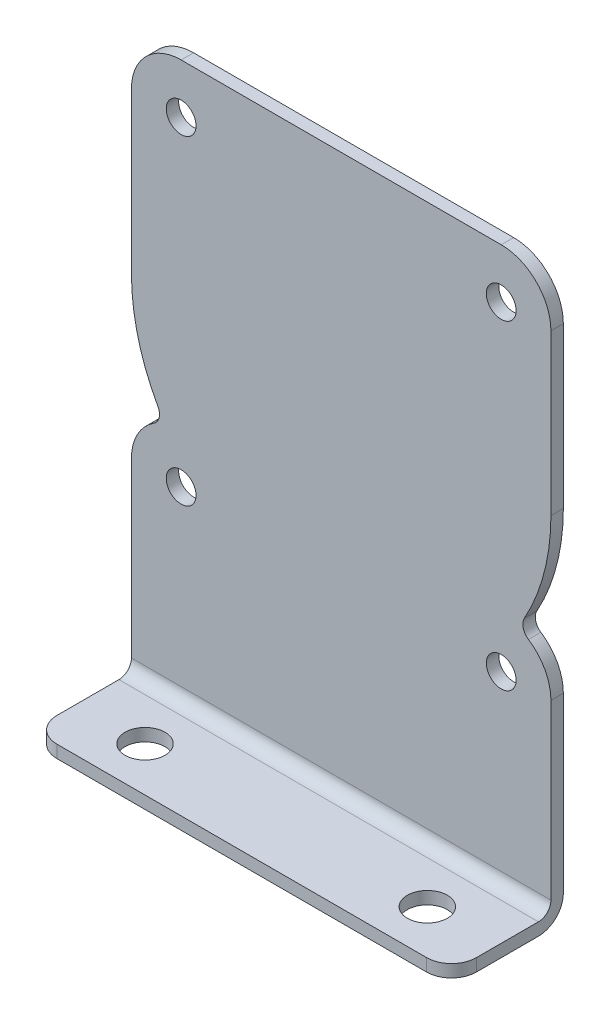
ISO-10303-21;
HEADER;
FILE_DESCRIPTION(('STEP AP214'),'2;1');
FILE_NAME('part.step','',(''),(''),'','','');
FILE_SCHEMA(('AUTOMOTIVE_DESIGN { 1 0 10303 214 1 1 1 1 }'));
ENDSEC;
DATA;
#1=APPLICATION_CONTEXT('core data for automotive mechanical design processes');
#2=APPLICATION_PROTOCOL_DEFINITION('international standard','automotive_design',2000,#1);
#3=PRODUCT_CONTEXT('',#1,'mechanical');
#4=PRODUCT('Part','Part','',(#3));
#5=PRODUCT_RELATED_PRODUCT_CATEGORY('part','',(#4));
#6=PRODUCT_DEFINITION_FORMATION('','',#4);
#7=PRODUCT_DEFINITION_CONTEXT('part definition',#1,'design');
#8=PRODUCT_DEFINITION('design','',#6,#7);
#9=PRODUCT_DEFINITION_SHAPE('','',#8);
#10=(LENGTH_UNIT() NAMED_UNIT(*) SI_UNIT(.MILLI.,.METRE.));
#11=(NAMED_UNIT(*) PLANE_ANGLE_UNIT() SI_UNIT($,.RADIAN.));
#12=(NAMED_UNIT(*) SI_UNIT($,.STERADIAN.) SOLID_ANGLE_UNIT());
#13=UNCERTAINTY_MEASURE_WITH_UNIT(LENGTH_MEASURE(1.E-05),#10,'distance_accuracy_value','');
#14=(GEOMETRIC_REPRESENTATION_CONTEXT(3) GLOBAL_UNCERTAINTY_ASSIGNED_CONTEXT((#13)) GLOBAL_UNIT_ASSIGNED_CONTEXT((#10,
#11,#12)) REPRESENTATION_CONTEXT('',''));
#15=CARTESIAN_POINT('',(0.,0.,0.));
#16=DIRECTION('',(0.,0.,1.));
#17=DIRECTION('',(1.,0.,0.));
#18=AXIS2_PLACEMENT_3D('',#15,#16,#17);
#19=CARTESIAN_POINT('',(23.622,-4.12115,11.1125));
#20=DIRECTION('',(0.,-1.,0.));
#21=DIRECTION('',(0.,0.,-1.));
#22=AXIS2_PLACEMENT_3D('',#19,#20,#21);
#23=CYLINDRICAL_SURFACE('',#22,3.175);
#24=CARTESIAN_POINT('',(23.622,-39.1922,11.1125));
#25=DIRECTION('',(0.,-1.,0.));
#26=DIRECTION('',(0.,0.,-1.));
#27=AXIS2_PLACEMENT_3D('',#24,#25,#26);
#28=CIRCLE('',#27,3.175);
#29=CARTESIAN_POINT('',(23.622,-39.1922,14.2875));
#30=VERTEX_POINT('',#29);
#31=CARTESIAN_POINT('',(26.797,-39.1922,11.1125));
#32=VERTEX_POINT('',#31);
#33=EDGE_CURVE('E20',#30,#32,#28,.F.);
#34=ORIENTED_EDGE('',*,*,#33,.F.);
#35=DIRECTION('',(0.,-1.,0.));
#36=VECTOR('',#35,1.);
#37=CARTESIAN_POINT('',(23.622,-39.9923,14.2875));
#38=LINE('',#37,#36);
#39=CARTESIAN_POINT('',(23.622,-40.7924,14.2875));
#40=VERTEX_POINT('',#39);
#41=EDGE_CURVE('E115',#40,#30,#38,.F.);
#42=ORIENTED_EDGE('',*,*,#41,.F.);
#43=CARTESIAN_POINT('',(23.622,-40.7924,11.1125));
#44=DIRECTION('',(0.,-1.,0.));
#45=DIRECTION('',(0.,0.,-1.));
#46=AXIS2_PLACEMENT_3D('',#43,#44,#45);
#47=CIRCLE('',#46,3.175);
#48=CARTESIAN_POINT('',(26.797,-40.7924,11.1125));
#49=VERTEX_POINT('',#48);
#50=EDGE_CURVE('E251',#49,#40,#47,.T.);
#51=ORIENTED_EDGE('',*,*,#50,.F.);
#52=DIRECTION('',(0.,-1.,0.));
#53=VECTOR('',#52,1.);
#54=CARTESIAN_POINT('',(26.797,-4.12115,11.1125));
#55=LINE('',#54,#53);
#56=EDGE_CURVE('E125',#49,#32,#55,.F.);
#57=ORIENTED_EDGE('',*,*,#56,.T.);
#58=EDGE_LOOP('',(#34,#42,#51,#57));
#59=FACE_BOUND('',#58,.T.);
#60=ADVANCED_FACE('F17',(#59),#23,.T.);
#61=CARTESIAN_POINT('',(0.,-39.9923,14.2875));
#62=DIRECTION('',(0.,0.,1.));
#63=DIRECTION('',(0.,-1.,0.));
#64=AXIS2_PLACEMENT_3D('',#61,#62,#63);
#65=PLANE('',#64);
#66=DIRECTION('',(0.,1.,0.));
#67=VECTOR('',#66,1.);
#68=CARTESIAN_POINT('',(-23.622,-35.87115,14.2875));
#69=LINE('',#68,#67);
#70=CARTESIAN_POINT('',(-23.622,-40.7924,14.2875));
#71=VERTEX_POINT('',#70);
#72=CARTESIAN_POINT('',(-23.622,-39.1922,14.2875));
#73=VERTEX_POINT('',#72);
#74=EDGE_CURVE('E139',#71,#73,#69,.T.);
#75=ORIENTED_EDGE('',*,*,#74,.F.);
#76=DIRECTION('',(1.,0.,0.));
#77=VECTOR('',#76,1.);
#78=CARTESIAN_POINT('',(-26.797,-40.7924,14.2875));
#79=LINE('',#78,#77);
#80=EDGE_CURVE('E120',#40,#71,#79,.F.);
#81=ORIENTED_EDGE('',*,*,#80,.F.);
#82=ORIENTED_EDGE('',*,*,#41,.T.);
#83=DIRECTION('',(1.,0.,0.));
#84=VECTOR('',#83,1.);
#85=CARTESIAN_POINT('',(-26.797,-39.1922,14.2875));
#86=LINE('',#85,#84);
#87=EDGE_CURVE('E119',#73,#30,#86,.T.);
#88=ORIENTED_EDGE('',*,*,#87,.F.);
#89=EDGE_LOOP('',(#75,#81,#82,#88));
#90=FACE_BOUND('',#89,.T.);
#91=ADVANCED_FACE('F118',(#90),#65,.T.);
#92=CARTESIAN_POINT('',(-23.622,-35.87115,11.1125));
#93=DIRECTION('',(0.,1.,0.));
#94=DIRECTION('',(0.,0.,1.));
#95=AXIS2_PLACEMENT_3D('',#92,#93,#94);
#96=CYLINDRICAL_SURFACE('',#95,3.175);
#97=CARTESIAN_POINT('',(-23.622,-40.7924,11.1125));
#98=DIRECTION('',(0.,1.,0.));
#99=DIRECTION('',(0.,0.,1.));
#100=AXIS2_PLACEMENT_3D('',#97,#98,#99);
#101=CIRCLE('',#100,3.175);
#102=CARTESIAN_POINT('',(-26.797,-40.7924,11.1125));
#103=VERTEX_POINT('',#102);
#104=EDGE_CURVE('E248',#71,#103,#101,.F.);
#105=ORIENTED_EDGE('',*,*,#104,.F.);
#106=ORIENTED_EDGE('',*,*,#74,.T.);
#107=CARTESIAN_POINT('',(-23.622,-39.1922,11.1125));
#108=DIRECTION('',(0.,1.,0.));
#109=DIRECTION('',(0.,0.,1.));
#110=AXIS2_PLACEMENT_3D('',#107,#108,#109);
#111=CIRCLE('',#110,3.175);
#112=CARTESIAN_POINT('',(-26.797,-39.1922,11.1125));
#113=VERTEX_POINT('',#112);
#114=EDGE_CURVE('E135',#113,#73,#111,.T.);
#115=ORIENTED_EDGE('',*,*,#114,.F.);
#116=DIRECTION('',(0.,1.,0.));
#117=VECTOR('',#116,1.);
#118=CARTESIAN_POINT('',(-26.797,-35.87115,11.1125));
#119=LINE('',#118,#117);
#120=EDGE_CURVE('E124',#113,#103,#119,.F.);
#121=ORIENTED_EDGE('',*,*,#120,.T.);
#122=EDGE_LOOP('',(#105,#106,#115,#121));
#123=FACE_BOUND('',#122,.T.);
#124=ADVANCED_FACE('F265',(#123),#96,.T.);
#125=CARTESIAN_POINT('',(-18.034,-130.509500058697,8.61414178252508));
#126=DIRECTION('',(0.,-1.,0.));
#127=DIRECTION('',(0.,0.,-1.));
#128=AXIS2_PLACEMENT_3D('',#125,#126,#127);
#129=CYLINDRICAL_SURFACE('',#128,2.5527);
#130=CARTESIAN_POINT('',(-18.034,-39.1922,8.61414178252508));
#131=DIRECTION('',(0.,-1.,0.));
#132=DIRECTION('',(0.,0.,-1.));
#133=AXIS2_PLACEMENT_3D('',#130,#131,#132);
#134=CIRCLE('',#133,2.5527);
#135=CARTESIAN_POINT('',(-18.034,-39.1922,6.06144178252508));
#136=VERTEX_POINT('',#135);
#137=EDGE_CURVE('E136',#136,#136,#134,.T.);
#138=ORIENTED_EDGE('',*,*,#137,.F.);
#139=EDGE_LOOP('',(#138));
#140=FACE_BOUND('',#139,.T.);
#141=CARTESIAN_POINT('',(-18.034,-40.7924,8.61414178252508));
#142=DIRECTION('',(0.,-1.,0.));
#143=DIRECTION('',(0.,0.,-1.));
#144=AXIS2_PLACEMENT_3D('',#141,#142,#143);
#145=CIRCLE('',#144,2.5527);
#146=CARTESIAN_POINT('',(-18.034,-40.7924,6.06144178252508));
#147=VERTEX_POINT('',#146);
#148=EDGE_CURVE('E245',#147,#147,#145,.F.);
#149=ORIENTED_EDGE('',*,*,#148,.F.);
#150=EDGE_LOOP('',(#149));
#151=FACE_BOUND('',#150,.T.);
#152=ADVANCED_FACE('F261',(#140,#151),#129,.F.);
#153=CARTESIAN_POINT('',(18.034,-130.509500058697,8.61414178252508));
#154=DIRECTION('',(0.,1.,0.));
#155=DIRECTION('',(0.,0.,1.));
#156=AXIS2_PLACEMENT_3D('',#153,#154,#155);
#157=CYLINDRICAL_SURFACE('',#156,2.5527);
#158=CARTESIAN_POINT('',(18.034,-39.1922,8.61414178252508));
#159=DIRECTION('',(0.,1.,0.));
#160=DIRECTION('',(0.,0.,1.));
#161=AXIS2_PLACEMENT_3D('',#158,#159,#160);
#162=CIRCLE('',#161,2.5527);
#163=CARTESIAN_POINT('',(18.034,-39.1922,11.1668417825251));
#164=VERTEX_POINT('',#163);
#165=EDGE_CURVE('E254',#164,#164,#162,.F.);
#166=ORIENTED_EDGE('',*,*,#165,.F.);
#167=EDGE_LOOP('',(#166));
#168=FACE_BOUND('',#167,.T.);
#169=CARTESIAN_POINT('',(18.034,-40.7924,8.61414178252508));
#170=DIRECTION('',(0.,1.,0.));
#171=DIRECTION('',(0.,0.,1.));
#172=AXIS2_PLACEMENT_3D('',#169,#170,#171);
#173=CIRCLE('',#172,2.5527);
#174=CARTESIAN_POINT('',(18.034,-40.7924,11.1668417825251));
#175=VERTEX_POINT('',#174);
#176=EDGE_CURVE('E241',#175,#175,#173,.T.);
#177=ORIENTED_EDGE('',*,*,#176,.F.);
#178=EDGE_LOOP('',(#177));
#179=FACE_BOUND('',#178,.T.);
#180=ADVANCED_FACE('F264',(#168,#179),#157,.F.);
#181=CARTESIAN_POINT('',(-26.797,-39.1922,1.5875));
#182=DIRECTION('',(0.,1.,0.));
#183=DIRECTION('',(0.,0.,1.));
#184=AXIS2_PLACEMENT_3D('',#181,#182,#183);
#185=PLANE('',#184);
#186=ORIENTED_EDGE('',*,*,#165,.T.);
#187=EDGE_LOOP('',(#186));
#188=FACE_BOUND('',#187,.T.);
#189=ORIENTED_EDGE('',*,*,#137,.T.);
#190=EDGE_LOOP('',(#189));
#191=FACE_BOUND('',#190,.T.);
#192=ORIENTED_EDGE('',*,*,#114,.T.);
#193=ORIENTED_EDGE('',*,*,#87,.T.);
#194=ORIENTED_EDGE('',*,*,#33,.T.);
#195=DIRECTION('',(0.,0.,-1.));
#196=VECTOR('',#195,1.);
#197=CARTESIAN_POINT('',(26.797,-39.1922,0.));
#198=LINE('',#197,#196);
#199=CARTESIAN_POINT('',(26.797,-39.1922,3.1877));
#200=VERTEX_POINT('',#199);
#201=EDGE_CURVE('E236',#200,#32,#198,.F.);
#202=ORIENTED_EDGE('',*,*,#201,.F.);
#203=DIRECTION('',(1.,0.,0.));
#204=VECTOR('',#203,1.);
#205=CARTESIAN_POINT('',(-13.3985,-39.1922,3.1877));
#206=LINE('',#205,#204);
#207=CARTESIAN_POINT('',(-26.797,-39.1922,3.1877));
#208=VERTEX_POINT('',#207);
#209=EDGE_CURVE('E253',#200,#208,#206,.F.);
#210=ORIENTED_EDGE('',*,*,#209,.T.);
#211=DIRECTION('',(0.,0.,1.));
#212=VECTOR('',#211,1.);
#213=CARTESIAN_POINT('',(-26.797,-39.1922,0.));
#214=LINE('',#213,#212);
#215=EDGE_CURVE('E206',#113,#208,#214,.F.);
#216=ORIENTED_EDGE('',*,*,#215,.F.);
#217=EDGE_LOOP('',(#192,#193,#194,#202,#210,#216));
#218=FACE_BOUND('',#217,.T.);
#219=ADVANCED_FACE('F130',(#188,#191,#218),#185,.T.);
#220=CARTESIAN_POINT('',(-13.3985,-37.592,3.1877));
#221=DIRECTION('',(1.,0.,0.));
#222=DIRECTION('',(0.,0.,-1.));
#223=AXIS2_PLACEMENT_3D('',#220,#221,#222);
#224=CYLINDRICAL_SURFACE('',#223,1.6002);
#225=ORIENTED_EDGE('',*,*,#209,.F.);
#226=CARTESIAN_POINT('',(26.797,-37.592,3.1877));
#227=DIRECTION('',(1.,0.,0.));
#228=DIRECTION('',(0.,0.,-1.));
#229=AXIS2_PLACEMENT_3D('',#226,#227,#228);
#230=CIRCLE('',#229,1.6002);
#231=CARTESIAN_POINT('',(26.797,-37.592,1.5875));
#232=VERTEX_POINT('',#231);
#233=EDGE_CURVE('E237',#232,#200,#230,.F.);
#234=ORIENTED_EDGE('',*,*,#233,.F.);
#235=DIRECTION('',(1.,0.,0.));
#236=VECTOR('',#235,1.);
#237=CARTESIAN_POINT('',(0.,-37.592,1.5875));
#238=LINE('',#237,#236);
#239=CARTESIAN_POINT('',(-26.797,-37.592,1.5875));
#240=VERTEX_POINT('',#239);
#241=EDGE_CURVE('E244',#240,#232,#238,.T.);
#242=ORIENTED_EDGE('',*,*,#241,.F.);
#243=CARTESIAN_POINT('',(-26.797,-37.592,3.1877));
#244=DIRECTION('',(1.,0.,0.));
#245=DIRECTION('',(0.,0.,-1.));
#246=AXIS2_PLACEMENT_3D('',#243,#244,#245);
#247=CIRCLE('',#246,1.6002);
#248=EDGE_CURVE('E203',#208,#240,#247,.T.);
#249=ORIENTED_EDGE('',*,*,#248,.F.);
#250=EDGE_LOOP('',(#225,#234,#242,#249));
#251=FACE_BOUND('',#250,.T.);
#252=ADVANCED_FACE('F273',(#251),#224,.F.);
#253=CARTESIAN_POINT('',(-26.797,-40.7924,1.5875));
#254=DIRECTION('',(0.,-1.,0.));
#255=DIRECTION('',(0.,0.,-1.));
#256=AXIS2_PLACEMENT_3D('',#253,#254,#255);
#257=PLANE('',#256);
#258=ORIENTED_EDGE('',*,*,#176,.T.);
#259=EDGE_LOOP('',(#258));
#260=FACE_BOUND('',#259,.T.);
#261=ORIENTED_EDGE('',*,*,#148,.T.);
#262=EDGE_LOOP('',(#261));
#263=FACE_BOUND('',#262,.T.);
#264=DIRECTION('',(-1.,0.,0.));
#265=VECTOR('',#264,1.);
#266=CARTESIAN_POINT('',(-13.3985,-40.7924,3.175));
#267=LINE('',#266,#265);
#268=CARTESIAN_POINT('',(26.797,-40.7924,3.175));
#269=VERTEX_POINT('',#268);
#270=CARTESIAN_POINT('',(-26.797,-40.7924,3.175));
#271=VERTEX_POINT('',#270);
#272=EDGE_CURVE('E197',#269,#271,#267,.T.);
#273=ORIENTED_EDGE('',*,*,#272,.F.);
#274=DIRECTION('',(0.,0.,-1.));
#275=VECTOR('',#274,1.);
#276=CARTESIAN_POINT('',(26.797,-40.7924,0.));
#277=LINE('',#276,#275);
#278=EDGE_CURVE('E281',#49,#269,#277,.T.);
#279=ORIENTED_EDGE('',*,*,#278,.F.);
#280=ORIENTED_EDGE('',*,*,#50,.T.);
#281=ORIENTED_EDGE('',*,*,#80,.T.);
#282=ORIENTED_EDGE('',*,*,#104,.T.);
#283=DIRECTION('',(0.,0.,1.));
#284=VECTOR('',#283,1.);
#285=CARTESIAN_POINT('',(-26.797,-40.7924,0.));
#286=LINE('',#285,#284);
#287=EDGE_CURVE('E202',#271,#103,#286,.T.);
#288=ORIENTED_EDGE('',*,*,#287,.F.);
#289=EDGE_LOOP('',(#273,#279,#280,#281,#282,#288));
#290=FACE_BOUND('',#289,.T.);
#291=ADVANCED_FACE('F269',(#260,#263,#290),#257,.T.);
#292=CARTESIAN_POINT('',(0.,0.,1.5875));
#293=DIRECTION('',(0.,0.,1.));
#294=DIRECTION('',(1.,0.,0.));
#295=AXIS2_PLACEMENT_3D('',#292,#293,#294);
#296=PLANE('',#295);
#297=CARTESIAN_POINT('',(-20.447,25.4,1.58750000000001));
#298=DIRECTION('',(0.,0.,1.));
#299=DIRECTION('',(1.,0.,0.));
#300=AXIS2_PLACEMENT_3D('',#297,#298,#299);
#301=CIRCLE('',#300,1.905);
#302=CARTESIAN_POINT('',(-18.542,25.4,1.58750000000001));
#303=VERTEX_POINT('',#302);
#304=EDGE_CURVE('E194',#303,#303,#301,.F.);
#305=ORIENTED_EDGE('',*,*,#304,.T.);
#306=EDGE_LOOP('',(#305));
#307=FACE_BOUND('',#306,.T.);
#308=CARTESIAN_POINT('',(20.447,25.4,1.58750000000001));
#309=DIRECTION('',(0.,0.,1.));
#310=DIRECTION('',(1.,0.,0.));
#311=AXIS2_PLACEMENT_3D('',#308,#309,#310);
#312=CIRCLE('',#311,1.905);
#313=CARTESIAN_POINT('',(22.352,25.4,1.58750000000001));
#314=VERTEX_POINT('',#313);
#315=EDGE_CURVE('E191',#314,#314,#312,.F.);
#316=ORIENTED_EDGE('',*,*,#315,.T.);
#317=EDGE_LOOP('',(#316));
#318=FACE_BOUND('',#317,.T.);
#319=CARTESIAN_POINT('',(20.447,-15.4939999999998,1.58750000000001));
#320=DIRECTION('',(0.,0.,1.));
#321=DIRECTION('',(1.,0.,0.));
#322=AXIS2_PLACEMENT_3D('',#319,#320,#321);
#323=CIRCLE('',#322,1.905);
#324=CARTESIAN_POINT('',(22.352,-15.4939999999998,1.58750000000001));
#325=VERTEX_POINT('',#324);
#326=EDGE_CURVE('E188',#325,#325,#323,.F.);
#327=ORIENTED_EDGE('',*,*,#326,.T.);
#328=EDGE_LOOP('',(#327));
#329=FACE_BOUND('',#328,.T.);
#330=CARTESIAN_POINT('',(-20.4469999999999,-15.4939999999998,1.58750000000001));
#331=DIRECTION('',(0.,0.,1.));
#332=DIRECTION('',(1.,0.,0.));
#333=AXIS2_PLACEMENT_3D('',#330,#331,#332);
#334=CIRCLE('',#333,1.905);
#335=CARTESIAN_POINT('',(-18.5419999999999,-15.4939999999998,1.58750000000001));
#336=VERTEX_POINT('',#335);
#337=EDGE_CURVE('E185',#336,#336,#334,.F.);
#338=ORIENTED_EDGE('',*,*,#337,.T.);
#339=EDGE_LOOP('',(#338));
#340=FACE_BOUND('',#339,.T.);
#341=CARTESIAN_POINT('',(-20.4469999999999,-15.4939999999998,1.5875));
#342=DIRECTION('',(0.,0.,-1.));
#343=DIRECTION('',(-1.,0.,0.));
#344=AXIS2_PLACEMENT_3D('',#341,#342,#343);
#345=CIRCLE('',#344,6.34999999999997);
#346=CARTESIAN_POINT('',(-26.797,-15.4939999999998,1.5875));
#347=VERTEX_POINT('',#346);
#348=CARTESIAN_POINT('',(-23.9286348770226,-10.1835651229772,1.5875));
#349=VERTEX_POINT('',#348);
#350=EDGE_CURVE('E207',#347,#349,#345,.T.);
#351=ORIENTED_EDGE('',*,*,#350,.F.);
#352=DIRECTION('',(0.,1.,0.));
#353=VECTOR('',#352,1.);
#354=CARTESIAN_POINT('',(-26.797,-31.75,1.5875));
#355=LINE('',#354,#353);
#356=EDGE_CURVE('E205',#240,#347,#355,.T.);
#357=ORIENTED_EDGE('',*,*,#356,.F.);
#358=ORIENTED_EDGE('',*,*,#241,.T.);
#359=DIRECTION('',(0.,1.,0.));
#360=VECTOR('',#359,1.);
#361=CARTESIAN_POINT('',(26.797,31.75,1.5875));
#362=LINE('',#361,#360);
#363=CARTESIAN_POINT('',(26.797,-15.4939999999998,1.5875));
#364=VERTEX_POINT('',#363);
#365=EDGE_CURVE('E240',#364,#232,#362,.F.);
#366=ORIENTED_EDGE('',*,*,#365,.F.);
#367=CARTESIAN_POINT('',(20.447,-15.4939999999998,1.5875));
#368=DIRECTION('',(0.,0.,-1.));
#369=DIRECTION('',(-1.,0.,0.));
#370=AXIS2_PLACEMENT_3D('',#367,#368,#369);
#371=CIRCLE('',#370,6.34999999999997);
#372=CARTESIAN_POINT('',(23.9286348770226,-10.1835651229772,1.5875));
#373=VERTEX_POINT('',#372);
#374=EDGE_CURVE('E233',#373,#364,#371,.T.);
#375=ORIENTED_EDGE('',*,*,#374,.F.);
#376=CARTESIAN_POINT('',(24.7990435962783,-8.85595640372149,1.5875));
#377=DIRECTION('',(0.,0.,-1.));
#378=DIRECTION('',(-1.,0.,0.));
#379=AXIS2_PLACEMENT_3D('',#376,#377,#378);
#380=CIRCLE('',#379,1.5875);
#381=CARTESIAN_POINT('',(23.4120724779183,-8.08364340575053,1.5875));
#382=VERTEX_POINT('',#381);
#383=EDGE_CURVE('E229',#373,#382,#380,.T.);
#384=ORIENTED_EDGE('',*,*,#383,.T.);
#385=CARTESIAN_POINT('',(0.,4.95300000000008,1.5875));
#386=DIRECTION('',(0.,0.,-1.));
#387=DIRECTION('',(-1.,0.,0.));
#388=AXIS2_PLACEMENT_3D('',#385,#386,#387);
#389=CIRCLE('',#388,26.797);
#390=CARTESIAN_POINT('',(26.797,4.95300000000008,1.5875));
#391=VERTEX_POINT('',#390);
#392=EDGE_CURVE('E226',#391,#382,#389,.T.);
#393=ORIENTED_EDGE('',*,*,#392,.F.);
#394=DIRECTION('',(0.,1.,0.));
#395=VECTOR('',#394,1.);
#396=CARTESIAN_POINT('',(26.797,31.75,1.5875));
#397=LINE('',#396,#395);
#398=CARTESIAN_POINT('',(26.797,25.4,1.5875));
#399=VERTEX_POINT('',#398);
#400=EDGE_CURVE('E225',#399,#391,#397,.F.);
#401=ORIENTED_EDGE('',*,*,#400,.F.);
#402=CARTESIAN_POINT('',(20.447,25.4,1.5875));
#403=DIRECTION('',(0.,0.,-1.));
#404=DIRECTION('',(-1.,0.,0.));
#405=AXIS2_PLACEMENT_3D('',#402,#403,#404);
#406=CIRCLE('',#405,6.34999999999997);
#407=CARTESIAN_POINT('',(20.4469999999999,31.75,1.5875));
#408=VERTEX_POINT('',#407);
#409=EDGE_CURVE('E222',#408,#399,#406,.T.);
#410=ORIENTED_EDGE('',*,*,#409,.F.);
#411=DIRECTION('',(1.,0.,0.));
#412=VECTOR('',#411,1.);
#413=CARTESIAN_POINT('',(-26.797,31.75,1.5875));
#414=LINE('',#413,#412);
#415=CARTESIAN_POINT('',(-20.447,31.75,1.5875));
#416=VERTEX_POINT('',#415);
#417=EDGE_CURVE('E293',#416,#408,#414,.T.);
#418=ORIENTED_EDGE('',*,*,#417,.F.);
#419=CARTESIAN_POINT('',(-20.447,25.4,1.5875));
#420=DIRECTION('',(0.,0.,-1.));
#421=DIRECTION('',(-1.,0.,0.));
#422=AXIS2_PLACEMENT_3D('',#419,#420,#421);
#423=CIRCLE('',#422,6.34999999999997);
#424=CARTESIAN_POINT('',(-26.797,25.4,1.5875));
#425=VERTEX_POINT('',#424);
#426=EDGE_CURVE('E218',#425,#416,#423,.T.);
#427=ORIENTED_EDGE('',*,*,#426,.F.);
#428=DIRECTION('',(0.,1.,0.));
#429=VECTOR('',#428,1.);
#430=CARTESIAN_POINT('',(-26.797,-31.75,1.5875));
#431=LINE('',#430,#429);
#432=CARTESIAN_POINT('',(-26.797,4.95300000000008,1.5875));
#433=VERTEX_POINT('',#432);
#434=EDGE_CURVE('E291',#433,#425,#431,.T.);
#435=ORIENTED_EDGE('',*,*,#434,.F.);
#436=CARTESIAN_POINT('',(0.,4.95300000000008,1.5875));
#437=DIRECTION('',(0.,0.,-1.));
#438=DIRECTION('',(-1.,0.,0.));
#439=AXIS2_PLACEMENT_3D('',#436,#437,#438);
#440=CIRCLE('',#439,26.797);
#441=CARTESIAN_POINT('',(-23.4120724779183,-8.08364340575051,1.5875));
#442=VERTEX_POINT('',#441);
#443=EDGE_CURVE('E214',#442,#433,#440,.T.);
#444=ORIENTED_EDGE('',*,*,#443,.F.);
#445=CARTESIAN_POINT('',(-24.7990435962783,-8.85595640372149,1.5875));
#446=DIRECTION('',(0.,0.,-1.));
#447=DIRECTION('',(-1.,0.,0.));
#448=AXIS2_PLACEMENT_3D('',#445,#446,#447);
#449=CIRCLE('',#448,1.58749999999999);
#450=EDGE_CURVE('E210',#442,#349,#449,.T.);
#451=ORIENTED_EDGE('',*,*,#450,.T.);
#452=EDGE_LOOP('',(#351,#357,#358,#366,#375,#384,#393,#401,#410,#418,#427,#435,#444,#451));
#453=FACE_BOUND('',#452,.T.);
#454=ADVANCED_FACE('F272',(#307,#318,#329,#340,#453),#296,.T.);
#455=CARTESIAN_POINT('',(26.797,31.75,0.));
#456=DIRECTION('',(1.,0.,0.));
#457=DIRECTION('',(0.,0.,-1.));
#458=AXIS2_PLACEMENT_3D('',#455,#456,#457);
#459=PLANE('',#458);
#460=ORIENTED_EDGE('',*,*,#233,.T.);
#461=ORIENTED_EDGE('',*,*,#201,.T.);
#462=ORIENTED_EDGE('',*,*,#56,.F.);
#463=ORIENTED_EDGE('',*,*,#278,.T.);
#464=CARTESIAN_POINT('',(26.797,-37.6174,3.175));
#465=DIRECTION('',(-1.,0.,0.));
#466=DIRECTION('',(0.,0.,1.));
#467=AXIS2_PLACEMENT_3D('',#464,#465,#466);
#468=CIRCLE('',#467,3.175);
#469=CARTESIAN_POINT('',(26.797,-37.6174,0.));
#470=VERTEX_POINT('',#469);
#471=EDGE_CURVE('E198',#470,#269,#468,.T.);
#472=ORIENTED_EDGE('',*,*,#471,.F.);
#473=DIRECTION('',(0.,1.,0.));
#474=VECTOR('',#473,1.);
#475=CARTESIAN_POINT('',(26.797,0.,0.));
#476=LINE('',#475,#474);
#477=CARTESIAN_POINT('',(26.797,-15.4939999999998,0.));
#478=VERTEX_POINT('',#477);
#479=EDGE_CURVE('E184',#470,#478,#476,.T.);
#480=ORIENTED_EDGE('',*,*,#479,.T.);
#481=DIRECTION('',(0.,0.,-1.));
#482=VECTOR('',#481,1.);
#483=CARTESIAN_POINT('',(26.7969999999999,-15.4939999999998,1.5875));
#484=LINE('',#483,#482);
#485=EDGE_CURVE('E235',#364,#478,#484,.T.);
#486=ORIENTED_EDGE('',*,*,#485,.F.);
#487=ORIENTED_EDGE('',*,*,#365,.T.);
#488=EDGE_LOOP('',(#460,#461,#462,#463,#472,#480,#486,#487));
#489=FACE_BOUND('',#488,.T.);
#490=ADVANCED_FACE('F318',(#489),#459,.T.);
#491=CARTESIAN_POINT('',(20.447,-15.4939999999998,1.5875));
#492=DIRECTION('',(0.,0.,-1.));
#493=DIRECTION('',(-1.,0.,0.));
#494=AXIS2_PLACEMENT_3D('',#491,#492,#493);
#495=CYLINDRICAL_SURFACE('',#494,6.34999999999997);
#496=ORIENTED_EDGE('',*,*,#374,.T.);
#497=ORIENTED_EDGE('',*,*,#485,.T.);
#498=CARTESIAN_POINT('',(20.447,-15.4939999999998,0.));
#499=DIRECTION('',(0.,0.,-1.));
#500=DIRECTION('',(-1.,0.,0.));
#501=AXIS2_PLACEMENT_3D('',#498,#499,#500);
#502=CIRCLE('',#501,6.34999999999997);
#503=CARTESIAN_POINT('',(23.9286348770226,-10.1835651229772,0.));
#504=VERTEX_POINT('',#503);
#505=EDGE_CURVE('E181',#478,#504,#502,.F.);
#506=ORIENTED_EDGE('',*,*,#505,.T.);
#507=DIRECTION('',(0.,0.,-1.));
#508=VECTOR('',#507,1.);
#509=CARTESIAN_POINT('',(23.9286348770226,-10.1835651229772,1.5875));
#510=LINE('',#509,#508);
#511=EDGE_CURVE('E232',#504,#373,#510,.F.);
#512=ORIENTED_EDGE('',*,*,#511,.T.);
#513=EDGE_LOOP('',(#496,#497,#506,#512));
#514=FACE_BOUND('',#513,.T.);
#515=ADVANCED_FACE('F425',(#514),#495,.T.);
#516=CARTESIAN_POINT('',(24.7990435962783,-8.85595640372149,1.5875));
#517=DIRECTION('',(0.,0.,-1.));
#518=DIRECTION('',(-1.,0.,0.));
#519=AXIS2_PLACEMENT_3D('',#516,#517,#518);
#520=CYLINDRICAL_SURFACE('',#519,1.5875);
#521=DIRECTION('',(0.,0.,-1.));
#522=VECTOR('',#521,1.);
#523=CARTESIAN_POINT('',(23.4120724779183,-8.08364340575054,1.5875));
#524=LINE('',#523,#522);
#525=CARTESIAN_POINT('',(23.4120724779183,-8.08364340575053,0.));
#526=VERTEX_POINT('',#525);
#527=EDGE_CURVE('E228',#382,#526,#524,.T.);
#528=ORIENTED_EDGE('',*,*,#527,.F.);
#529=ORIENTED_EDGE('',*,*,#383,.F.);
#530=ORIENTED_EDGE('',*,*,#511,.F.);
#531=CARTESIAN_POINT('',(24.7990435962783,-8.85595640372149,0.));
#532=DIRECTION('',(0.,0.,-1.));
#533=DIRECTION('',(-1.,0.,0.));
#534=AXIS2_PLACEMENT_3D('',#531,#532,#533);
#535=CIRCLE('',#534,1.5875);
#536=EDGE_CURVE('E178',#504,#526,#535,.T.);
#537=ORIENTED_EDGE('',*,*,#536,.T.);
#538=EDGE_LOOP('',(#528,#529,#530,#537));
#539=FACE_BOUND('',#538,.T.);
#540=ADVANCED_FACE('F422',(#539),#520,.F.);
#541=CARTESIAN_POINT('',(0.,4.95300000000008,1.5875));
#542=DIRECTION('',(0.,0.,-1.));
#543=DIRECTION('',(-1.,0.,0.));
#544=AXIS2_PLACEMENT_3D('',#541,#542,#543);
#545=CYLINDRICAL_SURFACE('',#544,26.797);
#546=ORIENTED_EDGE('',*,*,#392,.T.);
#547=ORIENTED_EDGE('',*,*,#527,.T.);
#548=CARTESIAN_POINT('',(0.,4.95300000000008,0.));
#549=DIRECTION('',(0.,0.,-1.));
#550=DIRECTION('',(-1.,0.,0.));
#551=AXIS2_PLACEMENT_3D('',#548,#549,#550);
#552=CIRCLE('',#551,26.797);
#553=CARTESIAN_POINT('',(26.797,4.95300000000008,0.));
#554=VERTEX_POINT('',#553);
#555=EDGE_CURVE('E175',#526,#554,#552,.F.);
#556=ORIENTED_EDGE('',*,*,#555,.T.);
#557=DIRECTION('',(0.,0.,-1.));
#558=VECTOR('',#557,1.);
#559=CARTESIAN_POINT('',(26.797,4.95300000000008,0.));
#560=LINE('',#559,#558);
#561=EDGE_CURVE('E295',#391,#554,#560,.T.);
#562=ORIENTED_EDGE('',*,*,#561,.F.);
#563=EDGE_LOOP('',(#546,#547,#556,#562));
#564=FACE_BOUND('',#563,.T.);
#565=ADVANCED_FACE('F428',(#564),#545,.T.);
#566=CARTESIAN_POINT('',(26.797,31.75,0.));
#567=DIRECTION('',(1.,0.,0.));
#568=DIRECTION('',(0.,0.,-1.));
#569=AXIS2_PLACEMENT_3D('',#566,#567,#568);
#570=PLANE('',#569);
#571=DIRECTION('',(0.,0.,-1.));
#572=VECTOR('',#571,1.);
#573=CARTESIAN_POINT('',(26.7969999999999,25.4,1.5875));
#574=LINE('',#573,#572);
#575=CARTESIAN_POINT('',(26.797,25.4,0.));
#576=VERTEX_POINT('',#575);
#577=EDGE_CURVE('E224',#399,#576,#574,.T.);
#578=ORIENTED_EDGE('',*,*,#577,.F.);
#579=ORIENTED_EDGE('',*,*,#400,.T.);
#580=ORIENTED_EDGE('',*,*,#561,.T.);
#581=DIRECTION('',(0.,1.,0.));
#582=VECTOR('',#581,1.);
#583=CARTESIAN_POINT('',(26.797,0.,0.));
#584=LINE('',#583,#582);
#585=EDGE_CURVE('E174',#554,#576,#584,.T.);
#586=ORIENTED_EDGE('',*,*,#585,.T.);
#587=EDGE_LOOP('',(#578,#579,#580,#586));
#588=FACE_BOUND('',#587,.T.);
#589=ADVANCED_FACE('F364',(#588),#570,.T.);
#590=CARTESIAN_POINT('',(20.447,25.4,1.5875));
#591=DIRECTION('',(0.,0.,-1.));
#592=DIRECTION('',(-1.,0.,0.));
#593=AXIS2_PLACEMENT_3D('',#590,#591,#592);
#594=CYLINDRICAL_SURFACE('',#593,6.34999999999997);
#595=ORIENTED_EDGE('',*,*,#409,.T.);
#596=ORIENTED_EDGE('',*,*,#577,.T.);
#597=CARTESIAN_POINT('',(20.447,25.4,0.));
#598=DIRECTION('',(0.,0.,-1.));
#599=DIRECTION('',(-1.,0.,0.));
#600=AXIS2_PLACEMENT_3D('',#597,#598,#599);
#601=CIRCLE('',#600,6.34999999999997);
#602=CARTESIAN_POINT('',(20.4469999999999,31.75,0.));
#603=VERTEX_POINT('',#602);
#604=EDGE_CURVE('E171',#576,#603,#601,.F.);
#605=ORIENTED_EDGE('',*,*,#604,.T.);
#606=DIRECTION('',(0.,0.,1.));
#607=VECTOR('',#606,1.);
#608=CARTESIAN_POINT('',(20.4469999999999,31.75,0.));
#609=LINE('',#608,#607);
#610=EDGE_CURVE('E221',#408,#603,#609,.F.);
#611=ORIENTED_EDGE('',*,*,#610,.F.);
#612=EDGE_LOOP('',(#595,#596,#605,#611));
#613=FACE_BOUND('',#612,.T.);
#614=ADVANCED_FACE('F362',(#613),#594,.T.);
#615=CARTESIAN_POINT('',(-26.797,31.75,0.));
#616=DIRECTION('',(0.,1.,0.));
#617=DIRECTION('',(0.,0.,1.));
#618=AXIS2_PLACEMENT_3D('',#615,#616,#617);
#619=PLANE('',#618);
#620=ORIENTED_EDGE('',*,*,#610,.T.);
#621=DIRECTION('',(1.,0.,0.));
#622=VECTOR('',#621,1.);
#623=CARTESIAN_POINT('',(0.,31.75,0.));
#624=LINE('',#623,#622);
#625=CARTESIAN_POINT('',(-20.447,31.75,0.));
#626=VERTEX_POINT('',#625);
#627=EDGE_CURVE('E170',#603,#626,#624,.F.);
#628=ORIENTED_EDGE('',*,*,#627,.T.);
#629=DIRECTION('',(0.,0.,-1.));
#630=VECTOR('',#629,1.);
#631=CARTESIAN_POINT('',(-20.447,31.75,1.5875));
#632=LINE('',#631,#630);
#633=EDGE_CURVE('E220',#416,#626,#632,.T.);
#634=ORIENTED_EDGE('',*,*,#633,.F.);
#635=ORIENTED_EDGE('',*,*,#417,.T.);
#636=EDGE_LOOP('',(#620,#628,#634,#635));
#637=FACE_BOUND('',#636,.T.);
#638=ADVANCED_FACE('F348',(#637),#619,.T.);
#639=CARTESIAN_POINT('',(-20.447,25.4,1.5875));
#640=DIRECTION('',(0.,0.,-1.));
#641=DIRECTION('',(-1.,0.,0.));
#642=AXIS2_PLACEMENT_3D('',#639,#640,#641);
#643=CYLINDRICAL_SURFACE('',#642,6.34999999999997);
#644=ORIENTED_EDGE('',*,*,#426,.T.);
#645=ORIENTED_EDGE('',*,*,#633,.T.);
#646=CARTESIAN_POINT('',(-20.447,25.4,0.));
#647=DIRECTION('',(0.,0.,-1.));
#648=DIRECTION('',(-1.,0.,0.));
#649=AXIS2_PLACEMENT_3D('',#646,#647,#648);
#650=CIRCLE('',#649,6.34999999999997);
#651=CARTESIAN_POINT('',(-26.797,25.4,0.));
#652=VERTEX_POINT('',#651);
#653=EDGE_CURVE('E167',#626,#652,#650,.F.);
#654=ORIENTED_EDGE('',*,*,#653,.T.);
#655=DIRECTION('',(0.,0.,1.));
#656=VECTOR('',#655,1.);
#657=CARTESIAN_POINT('',(-26.797,25.4,0.));
#658=LINE('',#657,#656);
#659=EDGE_CURVE('E217',#425,#652,#658,.F.);
#660=ORIENTED_EDGE('',*,*,#659,.F.);
#661=EDGE_LOOP('',(#644,#645,#654,#660));
#662=FACE_BOUND('',#661,.T.);
#663=ADVANCED_FACE('F409',(#662),#643,.T.);
#664=CARTESIAN_POINT('',(-26.797,-31.75,0.));
#665=DIRECTION('',(-1.,0.,0.));
#666=DIRECTION('',(0.,0.,1.));
#667=AXIS2_PLACEMENT_3D('',#664,#665,#666);
#668=PLANE('',#667);
#669=ORIENTED_EDGE('',*,*,#659,.T.);
#670=DIRECTION('',(0.,1.,0.));
#671=VECTOR('',#670,1.);
#672=CARTESIAN_POINT('',(-26.797,0.,0.));
#673=LINE('',#672,#671);
#674=CARTESIAN_POINT('',(-26.797,4.95300000000008,0.));
#675=VERTEX_POINT('',#674);
#676=EDGE_CURVE('E166',#652,#675,#673,.F.);
#677=ORIENTED_EDGE('',*,*,#676,.T.);
#678=DIRECTION('',(0.,0.,-1.));
#679=VECTOR('',#678,1.);
#680=CARTESIAN_POINT('',(-26.797,4.95300000000008,1.5875));
#681=LINE('',#680,#679);
#682=EDGE_CURVE('E216',#433,#675,#681,.T.);
#683=ORIENTED_EDGE('',*,*,#682,.F.);
#684=ORIENTED_EDGE('',*,*,#434,.T.);
#685=EDGE_LOOP('',(#669,#677,#683,#684));
#686=FACE_BOUND('',#685,.T.);
#687=ADVANCED_FACE('F404',(#686),#668,.T.);
#688=CARTESIAN_POINT('',(0.,4.95300000000008,1.5875));
#689=DIRECTION('',(0.,0.,-1.));
#690=DIRECTION('',(-1.,0.,0.));
#691=AXIS2_PLACEMENT_3D('',#688,#689,#690);
#692=CYLINDRICAL_SURFACE('',#691,26.797);
#693=ORIENTED_EDGE('',*,*,#443,.T.);
#694=ORIENTED_EDGE('',*,*,#682,.T.);
#695=CARTESIAN_POINT('',(0.,4.95300000000008,0.));
#696=DIRECTION('',(0.,0.,-1.));
#697=DIRECTION('',(-1.,0.,0.));
#698=AXIS2_PLACEMENT_3D('',#695,#696,#697);
#699=CIRCLE('',#698,26.797);
#700=CARTESIAN_POINT('',(-23.4120724779182,-8.08364340575049,0.));
#701=VERTEX_POINT('',#700);
#702=EDGE_CURVE('E163',#675,#701,#699,.F.);
#703=ORIENTED_EDGE('',*,*,#702,.T.);
#704=DIRECTION('',(0.,0.,-1.));
#705=VECTOR('',#704,1.);
#706=CARTESIAN_POINT('',(-23.4120724779182,-8.08364340575049,1.5875));
#707=LINE('',#706,#705);
#708=EDGE_CURVE('E213',#701,#442,#707,.F.);
#709=ORIENTED_EDGE('',*,*,#708,.T.);
#710=EDGE_LOOP('',(#693,#694,#703,#709));
#711=FACE_BOUND('',#710,.T.);
#712=ADVANCED_FACE('F398',(#711),#692,.T.);
#713=CARTESIAN_POINT('',(-24.7990435962783,-8.85595640372149,1.5875));
#714=DIRECTION('',(0.,0.,-1.));
#715=DIRECTION('',(-1.,0.,0.));
#716=AXIS2_PLACEMENT_3D('',#713,#714,#715);
#717=CYLINDRICAL_SURFACE('',#716,1.58749999999999);
#718=DIRECTION('',(0.,0.,-1.));
#719=VECTOR('',#718,1.);
#720=CARTESIAN_POINT('',(-23.9286348770226,-10.1835651229772,1.5875));
#721=LINE('',#720,#719);
#722=CARTESIAN_POINT('',(-23.9286348770226,-10.1835651229772,0.));
#723=VERTEX_POINT('',#722);
#724=EDGE_CURVE('E209',#349,#723,#721,.T.);
#725=ORIENTED_EDGE('',*,*,#724,.F.);
#726=ORIENTED_EDGE('',*,*,#450,.F.);
#727=ORIENTED_EDGE('',*,*,#708,.F.);
#728=CARTESIAN_POINT('',(-24.7990435962783,-8.85595640372149,0.));
#729=DIRECTION('',(0.,0.,-1.));
#730=DIRECTION('',(-1.,0.,0.));
#731=AXIS2_PLACEMENT_3D('',#728,#729,#730);
#732=CIRCLE('',#731,1.58749999999999);
#733=EDGE_CURVE('E160',#701,#723,#732,.T.);
#734=ORIENTED_EDGE('',*,*,#733,.T.);
#735=EDGE_LOOP('',(#725,#726,#727,#734));
#736=FACE_BOUND('',#735,.T.);
#737=ADVANCED_FACE('F391',(#736),#717,.F.);
#738=CARTESIAN_POINT('',(-20.4469999999999,-15.4939999999998,1.5875));
#739=DIRECTION('',(0.,0.,-1.));
#740=DIRECTION('',(-1.,0.,0.));
#741=AXIS2_PLACEMENT_3D('',#738,#739,#740);
#742=CYLINDRICAL_SURFACE('',#741,6.34999999999997);
#743=ORIENTED_EDGE('',*,*,#350,.T.);
#744=ORIENTED_EDGE('',*,*,#724,.T.);
#745=CARTESIAN_POINT('',(-20.4469999999999,-15.4939999999998,0.));
#746=DIRECTION('',(0.,0.,-1.));
#747=DIRECTION('',(-1.,0.,0.));
#748=AXIS2_PLACEMENT_3D('',#745,#746,#747);
#749=CIRCLE('',#748,6.34999999999997);
#750=CARTESIAN_POINT('',(-26.797,-15.4939999999998,0.));
#751=VERTEX_POINT('',#750);
#752=EDGE_CURVE('E156',#723,#751,#749,.F.);
#753=ORIENTED_EDGE('',*,*,#752,.T.);
#754=DIRECTION('',(0.,0.,1.));
#755=VECTOR('',#754,1.);
#756=CARTESIAN_POINT('',(-26.797,-15.4939999999998,0.));
#757=LINE('',#756,#755);
#758=EDGE_CURVE('E331',#347,#751,#757,.F.);
#759=ORIENTED_EDGE('',*,*,#758,.F.);
#760=EDGE_LOOP('',(#743,#744,#753,#759));
#761=FACE_BOUND('',#760,.T.);
#762=ADVANCED_FACE('F385',(#761),#742,.T.);
#763=CARTESIAN_POINT('',(-26.797,-31.75,0.));
#764=DIRECTION('',(-1.,0.,0.));
#765=DIRECTION('',(0.,0.,1.));
#766=AXIS2_PLACEMENT_3D('',#763,#764,#765);
#767=PLANE('',#766);
#768=CARTESIAN_POINT('',(-26.797,-37.6174,3.175));
#769=DIRECTION('',(-1.,0.,0.));
#770=DIRECTION('',(0.,0.,1.));
#771=AXIS2_PLACEMENT_3D('',#768,#769,#770);
#772=CIRCLE('',#771,3.175);
#773=CARTESIAN_POINT('',(-26.797,-37.6174,0.));
#774=VERTEX_POINT('',#773);
#775=EDGE_CURVE('E35',#271,#774,#772,.F.);
#776=ORIENTED_EDGE('',*,*,#775,.F.);
#777=ORIENTED_EDGE('',*,*,#287,.T.);
#778=ORIENTED_EDGE('',*,*,#120,.F.);
#779=ORIENTED_EDGE('',*,*,#215,.T.);
#780=ORIENTED_EDGE('',*,*,#248,.T.);
#781=ORIENTED_EDGE('',*,*,#356,.T.);
#782=ORIENTED_EDGE('',*,*,#758,.T.);
#783=DIRECTION('',(0.,1.,0.));
#784=VECTOR('',#783,1.);
#785=CARTESIAN_POINT('',(-26.797,0.,0.));
#786=LINE('',#785,#784);
#787=EDGE_CURVE('E159',#751,#774,#786,.F.);
#788=ORIENTED_EDGE('',*,*,#787,.T.);
#789=EDGE_LOOP('',(#776,#777,#778,#779,#780,#781,#782,#788));
#790=FACE_BOUND('',#789,.T.);
#791=ADVANCED_FACE('F372',(#790),#767,.T.);
#792=CARTESIAN_POINT('',(-13.3985,-37.6174,3.175));
#793=DIRECTION('',(-1.,0.,0.));
#794=DIRECTION('',(0.,0.,1.));
#795=AXIS2_PLACEMENT_3D('',#792,#793,#794);
#796=CYLINDRICAL_SURFACE('',#795,3.175);
#797=ORIENTED_EDGE('',*,*,#471,.T.);
#798=ORIENTED_EDGE('',*,*,#272,.T.);
#799=ORIENTED_EDGE('',*,*,#775,.T.);
#800=DIRECTION('',(1.,0.,0.));
#801=VECTOR('',#800,1.);
#802=CARTESIAN_POINT('',(0.,-37.6174,0.));
#803=LINE('',#802,#801);
#804=EDGE_CURVE('E155',#774,#470,#803,.T.);
#805=ORIENTED_EDGE('',*,*,#804,.T.);
#806=EDGE_LOOP('',(#797,#798,#799,#805));
#807=FACE_BOUND('',#806,.T.);
#808=ADVANCED_FACE('F320',(#807),#796,.T.);
#809=CARTESIAN_POINT('',(-20.447,25.4,-89.7298000586965));
#810=DIRECTION('',(0.,0.,1.));
#811=DIRECTION('',(1.,0.,0.));
#812=AXIS2_PLACEMENT_3D('',#809,#810,#811);
#813=CYLINDRICAL_SURFACE('',#812,1.905);
#814=ORIENTED_EDGE('',*,*,#304,.F.);
#815=EDGE_LOOP('',(#814));
#816=FACE_BOUND('',#815,.T.);
#817=CARTESIAN_POINT('',(-20.447,25.4,0.));
#818=DIRECTION('',(0.,0.,1.));
#819=DIRECTION('',(1.,0.,0.));
#820=AXIS2_PLACEMENT_3D('',#817,#818,#819);
#821=CIRCLE('',#820,1.905);
#822=CARTESIAN_POINT('',(-18.542,25.4,0.));
#823=VERTEX_POINT('',#822);
#824=EDGE_CURVE('E152',#823,#823,#821,.F.);
#825=ORIENTED_EDGE('',*,*,#824,.T.);
#826=EDGE_LOOP('',(#825));
#827=FACE_BOUND('',#826,.T.);
#828=ADVANCED_FACE('F457',(#816,#827),#813,.F.);
#829=CARTESIAN_POINT('',(20.447,25.4,-89.7298000586965));
#830=DIRECTION('',(0.,0.,1.));
#831=DIRECTION('',(1.,0.,0.));
#832=AXIS2_PLACEMENT_3D('',#829,#830,#831);
#833=CYLINDRICAL_SURFACE('',#832,1.905);
#834=ORIENTED_EDGE('',*,*,#315,.F.);
#835=EDGE_LOOP('',(#834));
#836=FACE_BOUND('',#835,.T.);
#837=CARTESIAN_POINT('',(20.447,25.4,0.));
#838=DIRECTION('',(0.,0.,1.));
#839=DIRECTION('',(1.,0.,0.));
#840=AXIS2_PLACEMENT_3D('',#837,#838,#839);
#841=CIRCLE('',#840,1.905);
#842=CARTESIAN_POINT('',(22.352,25.4,0.));
#843=VERTEX_POINT('',#842);
#844=EDGE_CURVE('E149',#843,#843,#841,.F.);
#845=ORIENTED_EDGE('',*,*,#844,.T.);
#846=EDGE_LOOP('',(#845));
#847=FACE_BOUND('',#846,.T.);
#848=ADVANCED_FACE('F453',(#836,#847),#833,.F.);
#849=CARTESIAN_POINT('',(20.447,-15.4939999999998,-89.7298000586965));
#850=DIRECTION('',(0.,0.,1.));
#851=DIRECTION('',(1.,0.,0.));
#852=AXIS2_PLACEMENT_3D('',#849,#850,#851);
#853=CYLINDRICAL_SURFACE('',#852,1.905);
#854=ORIENTED_EDGE('',*,*,#326,.F.);
#855=EDGE_LOOP('',(#854));
#856=FACE_BOUND('',#855,.T.);
#857=CARTESIAN_POINT('',(20.447,-15.4939999999998,0.));
#858=DIRECTION('',(0.,0.,1.));
#859=DIRECTION('',(1.,0.,0.));
#860=AXIS2_PLACEMENT_3D('',#857,#858,#859);
#861=CIRCLE('',#860,1.905);
#862=CARTESIAN_POINT('',(22.352,-15.4939999999998,0.));
#863=VERTEX_POINT('',#862);
#864=EDGE_CURVE('E26',#863,#863,#861,.F.);
#865=ORIENTED_EDGE('',*,*,#864,.T.);
#866=EDGE_LOOP('',(#865));
#867=FACE_BOUND('',#866,.T.);
#868=ADVANCED_FACE('F445',(#856,#867),#853,.F.);
#869=CARTESIAN_POINT('',(-20.4469999999999,-15.4939999999998,-89.7298000586965));
#870=DIRECTION('',(0.,0.,1.));
#871=DIRECTION('',(1.,0.,0.));
#872=AXIS2_PLACEMENT_3D('',#869,#870,#871);
#873=CYLINDRICAL_SURFACE('',#872,1.905);
#874=ORIENTED_EDGE('',*,*,#337,.F.);
#875=EDGE_LOOP('',(#874));
#876=FACE_BOUND('',#875,.T.);
#877=CARTESIAN_POINT('',(-20.4469999999999,-15.4939999999998,0.));
#878=DIRECTION('',(0.,0.,1.));
#879=DIRECTION('',(1.,0.,0.));
#880=AXIS2_PLACEMENT_3D('',#877,#878,#879);
#881=CIRCLE('',#880,1.905);
#882=CARTESIAN_POINT('',(-18.5419999999999,-15.4939999999998,0.));
#883=VERTEX_POINT('',#882);
#884=EDGE_CURVE('E11',#883,#883,#881,.F.);
#885=ORIENTED_EDGE('',*,*,#884,.T.);
#886=EDGE_LOOP('',(#885));
#887=FACE_BOUND('',#886,.T.);
#888=ADVANCED_FACE('F439',(#876,#887),#873,.F.);
#889=CARTESIAN_POINT('',(0.,0.,0.));
#890=DIRECTION('',(0.,0.,1.));
#891=DIRECTION('',(1.,0.,0.));
#892=AXIS2_PLACEMENT_3D('',#889,#890,#891);
#893=PLANE('',#892);
#894=ORIENTED_EDGE('',*,*,#884,.F.);
#895=EDGE_LOOP('',(#894));
#896=FACE_BOUND('',#895,.T.);
#897=ORIENTED_EDGE('',*,*,#864,.F.);
#898=EDGE_LOOP('',(#897));
#899=FACE_BOUND('',#898,.T.);
#900=ORIENTED_EDGE('',*,*,#844,.F.);
#901=EDGE_LOOP('',(#900));
#902=FACE_BOUND('',#901,.T.);
#903=ORIENTED_EDGE('',*,*,#824,.F.);
#904=EDGE_LOOP('',(#903));
#905=FACE_BOUND('',#904,.T.);
#906=ORIENTED_EDGE('',*,*,#787,.F.);
#907=ORIENTED_EDGE('',*,*,#752,.F.);
#908=ORIENTED_EDGE('',*,*,#733,.F.);
#909=ORIENTED_EDGE('',*,*,#702,.F.);
#910=ORIENTED_EDGE('',*,*,#676,.F.);
#911=ORIENTED_EDGE('',*,*,#653,.F.);
#912=ORIENTED_EDGE('',*,*,#627,.F.);
#913=ORIENTED_EDGE('',*,*,#604,.F.);
#914=ORIENTED_EDGE('',*,*,#585,.F.);
#915=ORIENTED_EDGE('',*,*,#555,.F.);
#916=ORIENTED_EDGE('',*,*,#536,.F.);
#917=ORIENTED_EDGE('',*,*,#505,.F.);
#918=ORIENTED_EDGE('',*,*,#479,.F.);
#919=ORIENTED_EDGE('',*,*,#804,.F.);
#920=EDGE_LOOP('',(#906,#907,#908,#909,#910,#911,#912,#913,#914,#915,#916,#917,#918,#919));
#921=FACE_BOUND('',#920,.T.);
#922=ADVANCED_FACE('F358',(#896,#899,#902,#905,#921),#893,.F.);
#923=CLOSED_SHELL('',(#60,#91,#124,#152,#180,#219,#252,#291,#454,#490,#515,#540,#565,#589,#614,
#638,#663,#687,#712,#737,#762,#791,#808,#828,#848,#868,#888,#922));
#924=MANIFOLD_SOLID_BREP('B1',#923);
#925=ADVANCED_BREP_SHAPE_REPRESENTATION('',(#18,#924),#14);
#926=SHAPE_DEFINITION_REPRESENTATION(#9,#925);
ENDSEC;
END-ISO-10303-21;
